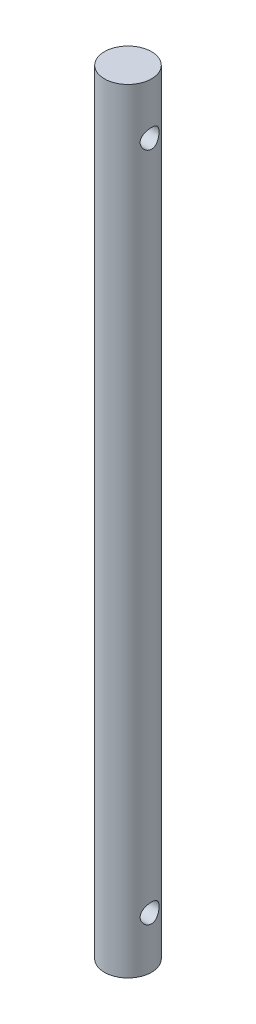
ISO-10303-21;
HEADER;
FILE_DESCRIPTION(('STEP AP214'),'2;1');
FILE_NAME('part.step','',(''),(''),'','','');
FILE_SCHEMA(('AUTOMOTIVE_DESIGN { 1 0 10303 214 1 1 1 1 }'));
ENDSEC;
DATA;
#1=APPLICATION_CONTEXT('core data for automotive mechanical design processes');
#2=APPLICATION_PROTOCOL_DEFINITION('international standard','automotive_design',2000,#1);
#3=PRODUCT_CONTEXT('',#1,'mechanical');
#4=PRODUCT('Part','Part','',(#3));
#5=PRODUCT_RELATED_PRODUCT_CATEGORY('part','',(#4));
#6=PRODUCT_DEFINITION_FORMATION('','',#4);
#7=PRODUCT_DEFINITION_CONTEXT('part definition',#1,'design');
#8=PRODUCT_DEFINITION('design','',#6,#7);
#9=PRODUCT_DEFINITION_SHAPE('','',#8);
#10=(LENGTH_UNIT() NAMED_UNIT(*) SI_UNIT(.MILLI.,.METRE.));
#11=(NAMED_UNIT(*) PLANE_ANGLE_UNIT() SI_UNIT($,.RADIAN.));
#12=(NAMED_UNIT(*) SI_UNIT($,.STERADIAN.) SOLID_ANGLE_UNIT());
#13=UNCERTAINTY_MEASURE_WITH_UNIT(LENGTH_MEASURE(1.E-05),#10,'distance_accuracy_value','');
#14=(GEOMETRIC_REPRESENTATION_CONTEXT(3) GLOBAL_UNCERTAINTY_ASSIGNED_CONTEXT((#13)) GLOBAL_UNIT_ASSIGNED_CONTEXT((#10,
#11,#12)) REPRESENTATION_CONTEXT('',''));
#15=CARTESIAN_POINT('',(0.,0.,0.));
#16=DIRECTION('',(0.,0.,1.));
#17=DIRECTION('',(1.,0.,0.));
#18=AXIS2_PLACEMENT_3D('',#15,#16,#17);
#19=CARTESIAN_POINT('',(0.,65.0875,0.));
#20=DIRECTION('',(0.,-1.,0.));
#21=DIRECTION('',(0.,0.,-1.));
#22=AXIS2_PLACEMENT_3D('',#19,#20,#21);
#23=CYLINDRICAL_SURFACE('',#22,3.9624);
#24=CARTESIAN_POINT('',(0.,65.0875,0.));
#25=DIRECTION('',(0.,1.,0.));
#26=DIRECTION('',(0.,0.,1.));
#27=AXIS2_PLACEMENT_3D('',#24,#25,#26);
#28=CIRCLE('',#27,3.9624);
#29=CARTESIAN_POINT('',(0.,65.0875,3.9624));
#30=VERTEX_POINT('',#29);
#31=EDGE_CURVE('E10',#30,#30,#28,.T.);
#32=ORIENTED_EDGE('',*,*,#31,.F.);
#33=EDGE_LOOP('',(#32));
#34=FACE_BOUND('',#33,.T.);
#35=CARTESIAN_POINT('',(0.,-65.0875,0.));
#36=DIRECTION('',(0.,1.,0.));
#37=DIRECTION('',(0.,0.,1.));
#38=AXIS2_PLACEMENT_3D('',#35,#36,#37);
#39=CIRCLE('',#38,3.9624);
#40=CARTESIAN_POINT('',(0.,-65.0875,3.9624));
#41=VERTEX_POINT('',#40);
#42=EDGE_CURVE('E49',#41,#41,#39,.T.);
#43=ORIENTED_EDGE('',*,*,#42,.T.);
#44=EDGE_LOOP('',(#43));
#45=FACE_BOUND('',#44,.T.);
#46=CARTESIAN_POINT('',(-3.63048998208231,56.4261,1.5875));
#47=CARTESIAN_POINT('',(-3.63049860166506,56.5111293845382,1.5874906563305));
#48=CARTESIAN_POINT('',(-3.63351930596472,56.5962783203316,1.58062803868289));
#49=CARTESIAN_POINT('',(-3.64522429294601,56.7641328251157,1.55343427483822));
#50=CARTESIAN_POINT('',(-3.65392301870693,56.8468315993453,1.53306877953104));
#51=CARTESIAN_POINT('',(-3.6758274235157,57.0070727308101,1.47977266239196));
#52=CARTESIAN_POINT('',(-3.68901606873711,57.0846332720007,1.44688947517429));
#53=CARTESIAN_POINT('',(-3.71839056207649,57.2331188224599,1.36963001807658));
#54=CARTESIAN_POINT('',(-3.73457576267749,57.3040452602982,1.3252562303428));
#55=CARTESIAN_POINT('',(-3.7691595137997,57.4413596627695,1.22355108799481));
#56=CARTESIAN_POINT('',(-3.78762941074348,57.5073194589445,1.16566565871302));
#57=CARTESIAN_POINT('',(-3.82411226056762,57.6289079566135,1.03974672153166));
#58=CARTESIAN_POINT('',(-3.84212505160211,57.6845330418104,0.971709676362397));
#59=CARTESIAN_POINT('',(-3.87652106762559,57.7860007114836,0.824109089564598));
#60=CARTESIAN_POINT('',(-3.89281157889371,57.8313689771764,0.744195920297095));
#61=CARTESIAN_POINT('',(-3.92106236727906,57.907835699004,0.577102307633441));
#62=CARTESIAN_POINT('',(-3.933024411366,57.9389399793815,0.489924847591702));
#63=CARTESIAN_POINT('',(-3.95076527021463,57.9844667474669,0.315267314673546));
#64=CARTESIAN_POINT('',(-3.95681609122412,57.9996258371754,0.228007430733204));
#65=CARTESIAN_POINT('',(-3.9630360750103,58.0152041272629,0.0519866998195689));
#66=CARTESIAN_POINT('',(-3.96320743882591,58.0156288436159,-0.0367735730163148));
#67=CARTESIAN_POINT('',(-3.95781451142904,58.0021294750461,-0.207949906853738));
#68=CARTESIAN_POINT('',(-3.95257286194732,57.9890125506948,-0.290441633410352));
#69=CARTESIAN_POINT('',(-3.93737807246517,57.9501755779891,-0.451939194524755));
#70=CARTESIAN_POINT('',(-3.9274245866756,57.9244546046522,-0.530944772778123));
#71=CARTESIAN_POINT('',(-3.90358943514598,57.8608240980416,-0.684652184104047));
#72=CARTESIAN_POINT('',(-3.88965079236787,57.8227365991651,-0.759271143743957));
#73=CARTESIAN_POINT('',(-3.85922785772182,57.7356212476473,-0.90125127765039));
#74=CARTESIAN_POINT('',(-3.84274269277477,57.6865896402264,-0.968609949217902));
#75=CARTESIAN_POINT('',(-3.80761790365709,57.5752157614139,-1.09886592962498));
#76=CARTESIAN_POINT('',(-3.78890789152213,57.5122096645085,-1.16117751121798));
#77=CARTESIAN_POINT('',(-3.75227824677165,57.3765703921452,-1.27459067863638));
#78=CARTESIAN_POINT('',(-3.73435887609313,57.3039340576677,-1.32568857135318));
#79=CARTESIAN_POINT('',(-3.70085976659175,57.148469067178,-1.41656981233452));
#80=CARTESIAN_POINT('',(-3.68536097780276,57.0654094418711,-1.45599039620024));
#81=CARTESIAN_POINT('',(-3.6594077545824,56.8930444613565,-1.52005182761746));
#82=CARTESIAN_POINT('',(-3.64895003225009,56.8037432207188,-1.54470231112915));
#83=CARTESIAN_POINT('',(-3.63506177785545,56.627273783136,-1.5770965133273));
#84=CARTESIAN_POINT('',(-3.63124011374553,56.5403098789753,-1.58578317134363));
#85=CARTESIAN_POINT('',(-3.62994222523247,56.3661019763384,-1.58875397256678));
#86=CARTESIAN_POINT('',(-3.63246406689444,56.2788580713248,-1.58304250530683));
#87=CARTESIAN_POINT('',(-3.64316752573291,56.111815271001,-1.55823779642885));
#88=CARTESIAN_POINT('',(-3.65101705710506,56.0318760100021,-1.53992890484142));
#89=CARTESIAN_POINT('',(-3.6710790409435,55.8762576654666,-1.49146743619685));
#90=CARTESIAN_POINT('',(-3.68329246269244,55.800579532714,-1.46131222775465));
#91=CARTESIAN_POINT('',(-3.71131306850803,55.6522027243057,-1.38864671191941));
#92=CARTESIAN_POINT('',(-3.72724609634123,55.5797500019243,-1.34568423093518));
#93=CARTESIAN_POINT('',(-3.76071925377471,55.442751921432,-1.24908549925997));
#94=CARTESIAN_POINT('',(-3.77826003792424,55.3782098091029,-1.19544489078506));
#95=CARTESIAN_POINT('',(-3.8145427293604,55.2538905323707,-1.07431732957439));
#96=CARTESIAN_POINT('',(-3.83327726112235,55.1948215114262,-1.00609861662742));
#97=CARTESIAN_POINT('',(-3.86861354480797,55.0888590810262,-0.860270332155498));
#98=CARTESIAN_POINT('',(-3.88521520750415,55.0419661808687,-0.782660368015921));
#99=CARTESIAN_POINT('',(-3.91446977344994,54.9618560771463,-0.619969034383928));
#100=CARTESIAN_POINT('',(-3.92712323745666,54.9286369313032,-0.534888728095191));
#101=CARTESIAN_POINT('',(-3.94702042089246,54.8772032241517,-0.359715491215371));
#102=CARTESIAN_POINT('',(-3.95426708654169,54.8589804905853,-0.26962531935344));
#103=CARTESIAN_POINT('',(-3.9622183136021,54.8390299335087,-0.0933465475917312));
#104=CARTESIAN_POINT('',(-3.96331986080945,54.8363009632467,-0.00728829442001628));
#105=CARTESIAN_POINT('',(-3.95993014534731,54.8447698025987,0.164018576016514));
#106=CARTESIAN_POINT('',(-3.95543973400656,54.8559654922999,0.249267314532401));
#107=CARTESIAN_POINT('',(-3.94156960694888,54.8912502800895,0.413834923342558));
#108=CARTESIAN_POINT('',(-3.9323452183939,54.9149303868366,0.493255625112023));
#109=CARTESIAN_POINT('',(-3.90999589418671,54.9740814509483,0.646981594384498));
#110=CARTESIAN_POINT('',(-3.89687024029795,55.0095545795919,0.721285916839038));
#111=CARTESIAN_POINT('',(-3.86728397994749,55.0930521044932,0.866282923379317));
#112=CARTESIAN_POINT('',(-3.85070153581702,55.1415622922627,0.93667045523537));
#113=CARTESIAN_POINT('',(-3.81619715197457,55.2490314341318,1.06860248328371));
#114=CARTESIAN_POINT('',(-3.79827465712802,55.307994732601,1.13014328339426));
#115=CARTESIAN_POINT('',(-3.76172535168452,55.439024973444,1.2465916081757));
#116=CARTESIAN_POINT('',(-3.74312399092213,55.5116785362286,1.30084921065205));
#117=CARTESIAN_POINT('',(-3.70852195241108,55.6656491653313,1.39645088057639));
#118=CARTESIAN_POINT('',(-3.69252157720419,55.7469672376703,1.43779344628619));
#119=CARTESIAN_POINT('',(-3.66640976376903,55.9085306366957,1.50305593202854));
#120=CARTESIAN_POINT('',(-3.65589801573786,55.9882142463979,1.52820871192439));
#121=CARTESIAN_POINT('',(-3.64001365683373,56.15089574057,1.56567684110844));
#122=CARTESIAN_POINT('',(-3.63462674435827,56.2338837244735,1.5780279240854));
#123=CARTESIAN_POINT('',(-3.63103181794639,56.3535062646917,1.58625841384787));
#124=CARTESIAN_POINT('',(-3.63048630149823,56.3897922333837,1.58750398977098));
#125=CARTESIAN_POINT('',(-3.63048998208231,56.4261,1.5875));
#126=B_SPLINE_CURVE_WITH_KNOTS('',3,(#46,#47,#48,#49,#50,#51,#52,#53,#54,#55,#56,#57,#58,#59,
#60,#61,#62,#63,#64,#65,#66,#67,#68,#69,#70,#71,#72,#73,#74,#75,#76,#77,#78,#79,#80,#81,#82,#83,
#84,#85,#86,#87,#88,#89,#90,#91,#92,#93,#94,#95,#96,#97,#98,#99,#100,#101,#102,#103,#104,#105,
#106,#107,#108,#109,#110,#111,#112,#113,#114,#115,#116,#117,#118,#119,#120,#121,#122,#123,#124,
#125),.UNSPECIFIED.,.T.,.F.,(4,2,2,2,2,2,2,2,2,2,2,2,2,2,2,2,2,2,2,2,2,2,2,2,2,2,2,2,2,2,2,2,2,
2,2,2,2,2,2,4),(0.,0.254975059857857,0.510601235908147,0.765268230907546,1.01988025974786,
1.28774029193082,1.55569387724708,1.83425280969733,2.11269790000774,2.37762413584636,
2.64245119257701,2.89235609221845,3.14227933455946,3.3959716653771,3.64975116884933,
3.9202394699415,4.19081672022148,4.46908250974915,4.74716656145541,5.00822041169193,
5.26919468448779,5.5152370353265,5.7613340697085,6.0174291829533,6.27362902463016,
6.54882529246466,6.82403306924857,7.09920174084937,7.37422036047742,7.63124650264929,
7.88823351953261,8.13728161881956,8.3863755971601,8.64648818701369,8.90670913559175,
9.18310200074596,9.45952699243322,9.71108213833464,9.96193320560449,10.0708082141275),.UNSPECIFIED.);
#127=CARTESIAN_POINT('',(-3.63048998208231,56.4261,1.5875));
#128=VERTEX_POINT('',#127);
#129=EDGE_CURVE('E57',#128,#128,#126,.T.);
#130=ORIENTED_EDGE('',*,*,#129,.F.);
#131=EDGE_LOOP('',(#130));
#132=FACE_BOUND('',#131,.T.);
#133=CARTESIAN_POINT('',(3.63048998208231,56.4261,1.5875));
#134=CARTESIAN_POINT('',(3.63049860166506,56.3410706154618,1.5874906563305));
#135=CARTESIAN_POINT('',(3.63351930596472,56.2559216796684,1.58062803868289));
#136=CARTESIAN_POINT('',(3.64522429294601,56.0880671748843,1.55343427483822));
#137=CARTESIAN_POINT('',(3.65392301870693,56.0053684006547,1.53306877953104));
#138=CARTESIAN_POINT('',(3.6758274235157,55.8451272691899,1.47977266239196));
#139=CARTESIAN_POINT('',(3.68901606873711,55.7675667279993,1.44688947517429));
#140=CARTESIAN_POINT('',(3.71839056207649,55.6190811775401,1.36963001807658));
#141=CARTESIAN_POINT('',(3.73457576267749,55.5481547397018,1.3252562303428));
#142=CARTESIAN_POINT('',(3.7691595137997,55.4108403372304,1.22355108799481));
#143=CARTESIAN_POINT('',(3.78762941074348,55.3448805410555,1.16566565871302));
#144=CARTESIAN_POINT('',(3.82411226056762,55.2232920433865,1.03974672153166));
#145=CARTESIAN_POINT('',(3.84212505160211,55.1676669581896,0.971709676362397));
#146=CARTESIAN_POINT('',(3.87652106762559,55.0661992885164,0.824109089564598));
#147=CARTESIAN_POINT('',(3.89281157889371,55.0208310228235,0.744195920297095));
#148=CARTESIAN_POINT('',(3.92106236727906,54.944364300996,0.577102307633441));
#149=CARTESIAN_POINT('',(3.933024411366,54.9132600206185,0.489924847591702));
#150=CARTESIAN_POINT('',(3.95076527021463,54.8677332525331,0.315267314673546));
#151=CARTESIAN_POINT('',(3.95681609122412,54.8525741628246,0.228007430733205));
#152=CARTESIAN_POINT('',(3.9630360750103,54.8369958727371,0.0519866998195697));
#153=CARTESIAN_POINT('',(3.96320743882591,54.8365711563841,-0.0367735730163145));
#154=CARTESIAN_POINT('',(3.95781451142904,54.8500705249539,-0.207949906853738));
#155=CARTESIAN_POINT('',(3.95257286194732,54.8631874493052,-0.290441633410352));
#156=CARTESIAN_POINT('',(3.93737807246517,54.9020244220109,-0.451939194524755));
#157=CARTESIAN_POINT('',(3.9274245866756,54.9277453953477,-0.530944772778123));
#158=CARTESIAN_POINT('',(3.90358943514598,54.9913759019584,-0.684652184104047));
#159=CARTESIAN_POINT('',(3.88965079236787,55.0294634008349,-0.759271143743957));
#160=CARTESIAN_POINT('',(3.85922785772182,55.1165787523527,-0.90125127765039));
#161=CARTESIAN_POINT('',(3.84274269277477,55.1656103597736,-0.968609949217902));
#162=CARTESIAN_POINT('',(3.80761790365709,55.2769842385861,-1.09886592962498));
#163=CARTESIAN_POINT('',(3.78890789152213,55.3399903354915,-1.16117751121798));
#164=CARTESIAN_POINT('',(3.75227824677165,55.4756296078548,-1.27459067863638));
#165=CARTESIAN_POINT('',(3.73435887609313,55.5482659423322,-1.32568857135318));
#166=CARTESIAN_POINT('',(3.70085976659175,55.7037309328219,-1.41656981233452));
#167=CARTESIAN_POINT('',(3.68536097780276,55.7867905581289,-1.45599039620024));
#168=CARTESIAN_POINT('',(3.6594077545824,55.9591555386435,-1.52005182761746));
#169=CARTESIAN_POINT('',(3.64895003225009,56.0484567792812,-1.54470231112915));
#170=CARTESIAN_POINT('',(3.63506177785545,56.224926216864,-1.5770965133273));
#171=CARTESIAN_POINT('',(3.63124011374553,56.3118901210247,-1.58578317134363));
#172=CARTESIAN_POINT('',(3.62994222523247,56.4860980236615,-1.58875397256678));
#173=CARTESIAN_POINT('',(3.63246406689444,56.5733419286752,-1.58304250530683));
#174=CARTESIAN_POINT('',(3.64316752573291,56.740384728999,-1.55823779642885));
#175=CARTESIAN_POINT('',(3.65101705710506,56.8203239899979,-1.53992890484142));
#176=CARTESIAN_POINT('',(3.6710790409435,56.9759423345334,-1.49146743619685));
#177=CARTESIAN_POINT('',(3.68329246269244,57.051620467286,-1.46131222775466));
#178=CARTESIAN_POINT('',(3.71131306850803,57.1999972756943,-1.38864671191941));
#179=CARTESIAN_POINT('',(3.72724609634123,57.2724499980756,-1.34568423093518));
#180=CARTESIAN_POINT('',(3.76071925377471,57.409448078568,-1.24908549925997));
#181=CARTESIAN_POINT('',(3.77826003792424,57.4739901908971,-1.19544489078506));
#182=CARTESIAN_POINT('',(3.8145427293604,57.5983094676293,-1.07431732957439));
#183=CARTESIAN_POINT('',(3.83327726112235,57.6573784885738,-1.00609861662742));
#184=CARTESIAN_POINT('',(3.86861354480797,57.7633409189738,-0.860270332155498));
#185=CARTESIAN_POINT('',(3.88521520750415,57.8102338191313,-0.782660368015921));
#186=CARTESIAN_POINT('',(3.91446977344994,57.8903439228537,-0.619969034383928));
#187=CARTESIAN_POINT('',(3.92712323745666,57.9235630686967,-0.534888728095191));
#188=CARTESIAN_POINT('',(3.94702042089246,57.9749967758483,-0.359715491215371));
#189=CARTESIAN_POINT('',(3.95426708654169,57.9932195094147,-0.26962531935344));
#190=CARTESIAN_POINT('',(3.9622183136021,58.0131700664912,-0.0933465475917312));
#191=CARTESIAN_POINT('',(3.96331986080945,58.0158990367533,-0.00728829442001628));
#192=CARTESIAN_POINT('',(3.95993014534731,58.0074301974013,0.164018576016514));
#193=CARTESIAN_POINT('',(3.95543973400656,57.9962345077001,0.249267314532401));
#194=CARTESIAN_POINT('',(3.94156960694888,57.9609497199105,0.413834923342558));
#195=CARTESIAN_POINT('',(3.9323452183939,57.9372696131634,0.493255625112023));
#196=CARTESIAN_POINT('',(3.90999589418671,57.8781185490517,0.646981594384498));
#197=CARTESIAN_POINT('',(3.89687024029795,57.8426454204081,0.721285916839038));
#198=CARTESIAN_POINT('',(3.86728397994749,57.7591478955068,0.866282923379317));
#199=CARTESIAN_POINT('',(3.85070153581702,57.7106377077372,0.93667045523537));
#200=CARTESIAN_POINT('',(3.81619715197457,57.6031685658681,1.06860248328371));
#201=CARTESIAN_POINT('',(3.79827465712802,57.544205267399,1.13014328339426));
#202=CARTESIAN_POINT('',(3.76172535168452,57.413175026556,1.2465916081757));
#203=CARTESIAN_POINT('',(3.74312399092213,57.3405214637713,1.30084921065205));
#204=CARTESIAN_POINT('',(3.70852195241108,57.1865508346687,1.39645088057639));
#205=CARTESIAN_POINT('',(3.69252157720419,57.1052327623296,1.43779344628619));
#206=CARTESIAN_POINT('',(3.66640976376903,56.9436693633043,1.50305593202854));
#207=CARTESIAN_POINT('',(3.65589801573787,56.8639857536021,1.52820871192439));
#208=CARTESIAN_POINT('',(3.64001365683373,56.70130425943,1.56567684110844));
#209=CARTESIAN_POINT('',(3.63462674435827,56.6183162755265,1.5780279240854));
#210=CARTESIAN_POINT('',(3.63103181794639,56.4986937353083,1.58625841384787));
#211=CARTESIAN_POINT('',(3.63048630149823,56.4624077666163,1.58750398977098));
#212=CARTESIAN_POINT('',(3.63048998208231,56.4261,1.5875));
#213=B_SPLINE_CURVE_WITH_KNOTS('',3,(#133,#134,#135,#136,#137,#138,#139,#140,#141,#142,#143,
#144,#145,#146,#147,#148,#149,#150,#151,#152,#153,#154,#155,#156,#157,#158,#159,#160,#161,#162,
#163,#164,#165,#166,#167,#168,#169,#170,#171,#172,#173,#174,#175,#176,#177,#178,#179,#180,#181,
#182,#183,#184,#185,#186,#187,#188,#189,#190,#191,#192,#193,#194,#195,#196,#197,#198,#199,#200,
#201,#202,#203,#204,#205,#206,#207,#208,#209,#210,#211,#212),.UNSPECIFIED.,.T.,.F.,(4,2,2,2,2,2,
2,2,2,2,2,2,2,2,2,2,2,2,2,2,2,2,2,2,2,2,2,2,2,2,2,2,2,2,2,2,2,2,2,4),(0.,0.254975059857857,
0.510601235908147,0.765268230907546,1.01988025974786,1.28774029193082,1.55569387724708,
1.83425280969733,2.11269790000774,2.37762413584636,2.64245119257701,2.89235609221845,
3.14227933455946,3.3959716653771,3.64975116884933,3.9202394699415,4.19081672022148,
4.46908250974915,4.74716656145541,5.00822041169193,5.26919468448779,5.51523703532649,
5.7613340697085,6.01742918295329,6.27362902463016,6.54882529246466,6.82403306924857,
7.09920174084937,7.37422036047742,7.63124650264929,7.88823351953261,8.13728161881956,
8.3863755971601,8.64648818701369,8.90670913559175,9.18310200074596,9.45952699243321,
9.71108213833463,9.96193320560449,10.0708082141275),.UNSPECIFIED.);
#214=CARTESIAN_POINT('',(3.63048998208231,56.4261,1.5875));
#215=VERTEX_POINT('',#214);
#216=EDGE_CURVE('E54',#215,#215,#213,.T.);
#217=ORIENTED_EDGE('',*,*,#216,.F.);
#218=EDGE_LOOP('',(#217));
#219=FACE_BOUND('',#218,.T.);
#220=CARTESIAN_POINT('',(-3.63048998208231,-56.4261,1.5875));
#221=CARTESIAN_POINT('',(-3.63049860166506,-56.3410706154618,1.5874906563305));
#222=CARTESIAN_POINT('',(-3.63351930596472,-56.2559216796684,1.58062803868289));
#223=CARTESIAN_POINT('',(-3.64522429294601,-56.0880671748843,1.55343427483822));
#224=CARTESIAN_POINT('',(-3.65392301870693,-56.0053684006547,1.53306877953104));
#225=CARTESIAN_POINT('',(-3.6758274235157,-55.8451272691899,1.47977266239196));
#226=CARTESIAN_POINT('',(-3.68901606873711,-55.7675667279993,1.44688947517429));
#227=CARTESIAN_POINT('',(-3.71839056207649,-55.6190811775401,1.36963001807658));
#228=CARTESIAN_POINT('',(-3.73457576267749,-55.5481547397018,1.3252562303428));
#229=CARTESIAN_POINT('',(-3.7691595137997,-55.4108403372304,1.22355108799481));
#230=CARTESIAN_POINT('',(-3.78762941074348,-55.3448805410555,1.16566565871302));
#231=CARTESIAN_POINT('',(-3.82411226056762,-55.2232920433865,1.03974672153166));
#232=CARTESIAN_POINT('',(-3.84212505160211,-55.1676669581896,0.971709676362397));
#233=CARTESIAN_POINT('',(-3.87652106762559,-55.0661992885164,0.824109089564598));
#234=CARTESIAN_POINT('',(-3.89281157889371,-55.0208310228235,0.744195920297095));
#235=CARTESIAN_POINT('',(-3.92106236727906,-54.944364300996,0.577102307633441));
#236=CARTESIAN_POINT('',(-3.933024411366,-54.9132600206185,0.489924847591702));
#237=CARTESIAN_POINT('',(-3.95076527021463,-54.8677332525331,0.315267314673546));
#238=CARTESIAN_POINT('',(-3.95681609122412,-54.8525741628246,0.228007430733205));
#239=CARTESIAN_POINT('',(-3.9630360750103,-54.8369958727371,0.0519866998195697));
#240=CARTESIAN_POINT('',(-3.96320743882591,-54.8365711563841,-0.0367735730163145));
#241=CARTESIAN_POINT('',(-3.95781451142904,-54.8500705249539,-0.207949906853738));
#242=CARTESIAN_POINT('',(-3.95257286194732,-54.8631874493052,-0.290441633410352));
#243=CARTESIAN_POINT('',(-3.93737807246517,-54.9020244220109,-0.451939194524755));
#244=CARTESIAN_POINT('',(-3.9274245866756,-54.9277453953477,-0.530944772778123));
#245=CARTESIAN_POINT('',(-3.90358943514598,-54.9913759019584,-0.684652184104047));
#246=CARTESIAN_POINT('',(-3.88965079236787,-55.0294634008349,-0.759271143743957));
#247=CARTESIAN_POINT('',(-3.85922785772182,-55.1165787523527,-0.90125127765039));
#248=CARTESIAN_POINT('',(-3.84274269277477,-55.1656103597736,-0.968609949217902));
#249=CARTESIAN_POINT('',(-3.80761790365709,-55.2769842385861,-1.09886592962498));
#250=CARTESIAN_POINT('',(-3.78890789152213,-55.3399903354915,-1.16117751121798));
#251=CARTESIAN_POINT('',(-3.75227824677165,-55.4756296078548,-1.27459067863638));
#252=CARTESIAN_POINT('',(-3.73435887609313,-55.5482659423322,-1.32568857135318));
#253=CARTESIAN_POINT('',(-3.70085976659175,-55.7037309328219,-1.41656981233452));
#254=CARTESIAN_POINT('',(-3.68536097780276,-55.7867905581289,-1.45599039620024));
#255=CARTESIAN_POINT('',(-3.6594077545824,-55.9591555386435,-1.52005182761746));
#256=CARTESIAN_POINT('',(-3.64895003225009,-56.0484567792812,-1.54470231112915));
#257=CARTESIAN_POINT('',(-3.63506177785545,-56.224926216864,-1.5770965133273));
#258=CARTESIAN_POINT('',(-3.63124011374553,-56.3118901210247,-1.58578317134363));
#259=CARTESIAN_POINT('',(-3.62994222523247,-56.4860980236615,-1.58875397256678));
#260=CARTESIAN_POINT('',(-3.63246406689444,-56.5733419286752,-1.58304250530683));
#261=CARTESIAN_POINT('',(-3.64316752573291,-56.740384728999,-1.55823779642885));
#262=CARTESIAN_POINT('',(-3.65101705710506,-56.8203239899979,-1.53992890484142));
#263=CARTESIAN_POINT('',(-3.6710790409435,-56.9759423345334,-1.49146743619685));
#264=CARTESIAN_POINT('',(-3.68329246269244,-57.051620467286,-1.46131222775466));
#265=CARTESIAN_POINT('',(-3.71131306850803,-57.1999972756943,-1.38864671191941));
#266=CARTESIAN_POINT('',(-3.72724609634123,-57.2724499980756,-1.34568423093518));
#267=CARTESIAN_POINT('',(-3.76071925377471,-57.409448078568,-1.24908549925997));
#268=CARTESIAN_POINT('',(-3.77826003792424,-57.4739901908971,-1.19544489078506));
#269=CARTESIAN_POINT('',(-3.8145427293604,-57.5983094676293,-1.07431732957439));
#270=CARTESIAN_POINT('',(-3.83327726112235,-57.6573784885738,-1.00609861662742));
#271=CARTESIAN_POINT('',(-3.86861354480797,-57.7633409189738,-0.860270332155498));
#272=CARTESIAN_POINT('',(-3.88521520750415,-57.8102338191313,-0.782660368015921));
#273=CARTESIAN_POINT('',(-3.91446977344994,-57.8903439228537,-0.619969034383928));
#274=CARTESIAN_POINT('',(-3.92712323745666,-57.9235630686967,-0.534888728095191));
#275=CARTESIAN_POINT('',(-3.94702042089246,-57.9749967758483,-0.359715491215371));
#276=CARTESIAN_POINT('',(-3.95426708654169,-57.9932195094147,-0.26962531935344));
#277=CARTESIAN_POINT('',(-3.9622183136021,-58.0131700664912,-0.0933465475917312));
#278=CARTESIAN_POINT('',(-3.96331986080945,-58.0158990367533,-0.00728829442001628));
#279=CARTESIAN_POINT('',(-3.95993014534731,-58.0074301974013,0.164018576016514));
#280=CARTESIAN_POINT('',(-3.95543973400656,-57.9962345077001,0.249267314532401));
#281=CARTESIAN_POINT('',(-3.94156960694888,-57.9609497199105,0.413834923342558));
#282=CARTESIAN_POINT('',(-3.9323452183939,-57.9372696131634,0.493255625112023));
#283=CARTESIAN_POINT('',(-3.90999589418671,-57.8781185490517,0.646981594384498));
#284=CARTESIAN_POINT('',(-3.89687024029795,-57.8426454204081,0.721285916839038));
#285=CARTESIAN_POINT('',(-3.86728397994749,-57.7591478955068,0.866282923379317));
#286=CARTESIAN_POINT('',(-3.85070153581702,-57.7106377077372,0.93667045523537));
#287=CARTESIAN_POINT('',(-3.81619715197457,-57.6031685658681,1.06860248328371));
#288=CARTESIAN_POINT('',(-3.79827465712802,-57.544205267399,1.13014328339426));
#289=CARTESIAN_POINT('',(-3.76172535168452,-57.413175026556,1.2465916081757));
#290=CARTESIAN_POINT('',(-3.74312399092213,-57.3405214637713,1.30084921065205));
#291=CARTESIAN_POINT('',(-3.70852195241108,-57.1865508346687,1.39645088057639));
#292=CARTESIAN_POINT('',(-3.69252157720419,-57.1052327623296,1.43779344628619));
#293=CARTESIAN_POINT('',(-3.66640976376903,-56.9436693633043,1.50305593202854));
#294=CARTESIAN_POINT('',(-3.65589801573787,-56.8639857536021,1.52820871192439));
#295=CARTESIAN_POINT('',(-3.64001365683373,-56.70130425943,1.56567684110844));
#296=CARTESIAN_POINT('',(-3.63462674435827,-56.6183162755265,1.5780279240854));
#297=CARTESIAN_POINT('',(-3.63103181794639,-56.4986937353083,1.58625841384787));
#298=CARTESIAN_POINT('',(-3.63048630149823,-56.4624077666163,1.58750398977098));
#299=CARTESIAN_POINT('',(-3.63048998208231,-56.4261,1.5875));
#300=B_SPLINE_CURVE_WITH_KNOTS('',3,(#220,#221,#222,#223,#224,#225,#226,#227,#228,#229,#230,
#231,#232,#233,#234,#235,#236,#237,#238,#239,#240,#241,#242,#243,#244,#245,#246,#247,#248,#249,
#250,#251,#252,#253,#254,#255,#256,#257,#258,#259,#260,#261,#262,#263,#264,#265,#266,#267,#268,
#269,#270,#271,#272,#273,#274,#275,#276,#277,#278,#279,#280,#281,#282,#283,#284,#285,#286,#287,
#288,#289,#290,#291,#292,#293,#294,#295,#296,#297,#298,#299),.UNSPECIFIED.,.T.,.F.,(4,2,2,2,2,2,
2,2,2,2,2,2,2,2,2,2,2,2,2,2,2,2,2,2,2,2,2,2,2,2,2,2,2,2,2,2,2,2,2,4),(0.,0.254975059857857,
0.510601235908147,0.765268230907546,1.01988025974786,1.28774029193082,1.55569387724708,
1.83425280969733,2.11269790000774,2.37762413584636,2.64245119257701,2.89235609221845,
3.14227933455946,3.3959716653771,3.64975116884933,3.9202394699415,4.19081672022148,
4.46908250974915,4.74716656145541,5.00822041169193,5.26919468448779,5.51523703532649,
5.7613340697085,6.01742918295329,6.27362902463016,6.54882529246466,6.82403306924857,
7.09920174084937,7.37422036047742,7.63124650264929,7.88823351953261,8.13728161881956,
8.3863755971601,8.64648818701369,8.90670913559175,9.18310200074596,9.45952699243321,
9.71108213833463,9.96193320560449,10.0708082141275),.UNSPECIFIED.);
#301=CARTESIAN_POINT('',(-3.63048998208231,-56.4261,1.5875));
#302=VERTEX_POINT('',#301);
#303=EDGE_CURVE('E98',#302,#302,#300,.T.);
#304=ORIENTED_EDGE('',*,*,#303,.F.);
#305=EDGE_LOOP('',(#304));
#306=FACE_BOUND('',#305,.T.);
#307=CARTESIAN_POINT('',(3.63048998208231,-56.4261,1.5875));
#308=CARTESIAN_POINT('',(3.63049860166506,-56.5111293845382,1.5874906563305));
#309=CARTESIAN_POINT('',(3.63351930596472,-56.5962783203316,1.58062803868289));
#310=CARTESIAN_POINT('',(3.64522429294601,-56.7641328251157,1.55343427483822));
#311=CARTESIAN_POINT('',(3.65392301870693,-56.8468315993453,1.53306877953104));
#312=CARTESIAN_POINT('',(3.6758274235157,-57.0070727308101,1.47977266239196));
#313=CARTESIAN_POINT('',(3.68901606873711,-57.0846332720007,1.44688947517429));
#314=CARTESIAN_POINT('',(3.71839056207649,-57.2331188224599,1.36963001807658));
#315=CARTESIAN_POINT('',(3.73457576267749,-57.3040452602982,1.3252562303428));
#316=CARTESIAN_POINT('',(3.7691595137997,-57.4413596627695,1.22355108799481));
#317=CARTESIAN_POINT('',(3.78762941074348,-57.5073194589445,1.16566565871302));
#318=CARTESIAN_POINT('',(3.82411226056762,-57.6289079566135,1.03974672153166));
#319=CARTESIAN_POINT('',(3.84212505160211,-57.6845330418104,0.971709676362397));
#320=CARTESIAN_POINT('',(3.87652106762559,-57.7860007114836,0.824109089564598));
#321=CARTESIAN_POINT('',(3.89281157889371,-57.8313689771764,0.744195920297095));
#322=CARTESIAN_POINT('',(3.92106236727906,-57.907835699004,0.577102307633441));
#323=CARTESIAN_POINT('',(3.933024411366,-57.9389399793815,0.489924847591702));
#324=CARTESIAN_POINT('',(3.95076527021463,-57.9844667474669,0.315267314673546));
#325=CARTESIAN_POINT('',(3.95681609122412,-57.9996258371754,0.228007430733204));
#326=CARTESIAN_POINT('',(3.9630360750103,-58.0152041272629,0.0519866998195689));
#327=CARTESIAN_POINT('',(3.96320743882591,-58.0156288436159,-0.0367735730163148));
#328=CARTESIAN_POINT('',(3.95781451142904,-58.0021294750461,-0.207949906853738));
#329=CARTESIAN_POINT('',(3.95257286194732,-57.9890125506948,-0.290441633410352));
#330=CARTESIAN_POINT('',(3.93737807246517,-57.9501755779891,-0.451939194524755));
#331=CARTESIAN_POINT('',(3.9274245866756,-57.9244546046522,-0.530944772778123));
#332=CARTESIAN_POINT('',(3.90358943514598,-57.8608240980416,-0.684652184104047));
#333=CARTESIAN_POINT('',(3.88965079236787,-57.8227365991651,-0.759271143743957));
#334=CARTESIAN_POINT('',(3.85922785772182,-57.7356212476473,-0.90125127765039));
#335=CARTESIAN_POINT('',(3.84274269277477,-57.6865896402264,-0.968609949217902));
#336=CARTESIAN_POINT('',(3.80761790365709,-57.5752157614139,-1.09886592962498));
#337=CARTESIAN_POINT('',(3.78890789152213,-57.5122096645085,-1.16117751121798));
#338=CARTESIAN_POINT('',(3.75227824677165,-57.3765703921452,-1.27459067863638));
#339=CARTESIAN_POINT('',(3.73435887609313,-57.3039340576677,-1.32568857135318));
#340=CARTESIAN_POINT('',(3.70085976659175,-57.148469067178,-1.41656981233452));
#341=CARTESIAN_POINT('',(3.68536097780276,-57.0654094418711,-1.45599039620024));
#342=CARTESIAN_POINT('',(3.6594077545824,-56.8930444613565,-1.52005182761746));
#343=CARTESIAN_POINT('',(3.64895003225009,-56.8037432207188,-1.54470231112915));
#344=CARTESIAN_POINT('',(3.63506177785545,-56.627273783136,-1.5770965133273));
#345=CARTESIAN_POINT('',(3.63124011374553,-56.5403098789753,-1.58578317134363));
#346=CARTESIAN_POINT('',(3.62994222523247,-56.3661019763384,-1.58875397256678));
#347=CARTESIAN_POINT('',(3.63246406689444,-56.2788580713248,-1.58304250530683));
#348=CARTESIAN_POINT('',(3.64316752573291,-56.111815271001,-1.55823779642885));
#349=CARTESIAN_POINT('',(3.65101705710506,-56.0318760100021,-1.53992890484142));
#350=CARTESIAN_POINT('',(3.6710790409435,-55.8762576654666,-1.49146743619685));
#351=CARTESIAN_POINT('',(3.68329246269244,-55.800579532714,-1.46131222775465));
#352=CARTESIAN_POINT('',(3.71131306850803,-55.6522027243057,-1.38864671191941));
#353=CARTESIAN_POINT('',(3.72724609634123,-55.5797500019243,-1.34568423093518));
#354=CARTESIAN_POINT('',(3.76071925377471,-55.442751921432,-1.24908549925997));
#355=CARTESIAN_POINT('',(3.77826003792424,-55.3782098091029,-1.19544489078506));
#356=CARTESIAN_POINT('',(3.8145427293604,-55.2538905323707,-1.07431732957439));
#357=CARTESIAN_POINT('',(3.83327726112235,-55.1948215114262,-1.00609861662742));
#358=CARTESIAN_POINT('',(3.86861354480797,-55.0888590810262,-0.860270332155498));
#359=CARTESIAN_POINT('',(3.88521520750415,-55.0419661808687,-0.782660368015921));
#360=CARTESIAN_POINT('',(3.91446977344994,-54.9618560771463,-0.619969034383928));
#361=CARTESIAN_POINT('',(3.92712323745666,-54.9286369313032,-0.534888728095191));
#362=CARTESIAN_POINT('',(3.94702042089246,-54.8772032241517,-0.359715491215371));
#363=CARTESIAN_POINT('',(3.95426708654169,-54.8589804905853,-0.26962531935344));
#364=CARTESIAN_POINT('',(3.9622183136021,-54.8390299335087,-0.0933465475917312));
#365=CARTESIAN_POINT('',(3.96331986080945,-54.8363009632467,-0.00728829442001628));
#366=CARTESIAN_POINT('',(3.95993014534731,-54.8447698025987,0.164018576016514));
#367=CARTESIAN_POINT('',(3.95543973400656,-54.8559654922999,0.249267314532401));
#368=CARTESIAN_POINT('',(3.94156960694888,-54.8912502800895,0.413834923342558));
#369=CARTESIAN_POINT('',(3.9323452183939,-54.9149303868366,0.493255625112023));
#370=CARTESIAN_POINT('',(3.90999589418671,-54.9740814509483,0.646981594384498));
#371=CARTESIAN_POINT('',(3.89687024029795,-55.0095545795919,0.721285916839038));
#372=CARTESIAN_POINT('',(3.86728397994749,-55.0930521044932,0.866282923379317));
#373=CARTESIAN_POINT('',(3.85070153581702,-55.1415622922627,0.93667045523537));
#374=CARTESIAN_POINT('',(3.81619715197457,-55.2490314341318,1.06860248328371));
#375=CARTESIAN_POINT('',(3.79827465712802,-55.307994732601,1.13014328339426));
#376=CARTESIAN_POINT('',(3.76172535168452,-55.439024973444,1.2465916081757));
#377=CARTESIAN_POINT('',(3.74312399092213,-55.5116785362286,1.30084921065205));
#378=CARTESIAN_POINT('',(3.70852195241108,-55.6656491653313,1.39645088057639));
#379=CARTESIAN_POINT('',(3.69252157720419,-55.7469672376703,1.43779344628619));
#380=CARTESIAN_POINT('',(3.66640976376903,-55.9085306366957,1.50305593202854));
#381=CARTESIAN_POINT('',(3.65589801573786,-55.9882142463979,1.52820871192439));
#382=CARTESIAN_POINT('',(3.64001365683373,-56.15089574057,1.56567684110844));
#383=CARTESIAN_POINT('',(3.63462674435827,-56.2338837244735,1.5780279240854));
#384=CARTESIAN_POINT('',(3.63103181794639,-56.3535062646917,1.58625841384787));
#385=CARTESIAN_POINT('',(3.63048630149823,-56.3897922333837,1.58750398977098));
#386=CARTESIAN_POINT('',(3.63048998208231,-56.4261,1.5875));
#387=B_SPLINE_CURVE_WITH_KNOTS('',3,(#307,#308,#309,#310,#311,#312,#313,#314,#315,#316,#317,
#318,#319,#320,#321,#322,#323,#324,#325,#326,#327,#328,#329,#330,#331,#332,#333,#334,#335,#336,
#337,#338,#339,#340,#341,#342,#343,#344,#345,#346,#347,#348,#349,#350,#351,#352,#353,#354,#355,
#356,#357,#358,#359,#360,#361,#362,#363,#364,#365,#366,#367,#368,#369,#370,#371,#372,#373,#374,
#375,#376,#377,#378,#379,#380,#381,#382,#383,#384,#385,#386),.UNSPECIFIED.,.T.,.F.,(4,2,2,2,2,2,
2,2,2,2,2,2,2,2,2,2,2,2,2,2,2,2,2,2,2,2,2,2,2,2,2,2,2,2,2,2,2,2,2,4),(0.,0.254975059857857,
0.510601235908147,0.765268230907546,1.01988025974786,1.28774029193082,1.55569387724708,
1.83425280969733,2.11269790000774,2.37762413584636,2.64245119257701,2.89235609221845,
3.14227933455946,3.3959716653771,3.64975116884933,3.9202394699415,4.19081672022148,
4.46908250974915,4.74716656145541,5.00822041169193,5.26919468448779,5.5152370353265,
5.7613340697085,6.0174291829533,6.27362902463016,6.54882529246466,6.82403306924857,
7.09920174084937,7.37422036047742,7.63124650264929,7.88823351953261,8.13728161881956,
8.3863755971601,8.64648818701369,8.90670913559175,9.18310200074596,9.45952699243322,
9.71108213833464,9.96193320560449,10.0708082141275),.UNSPECIFIED.);
#388=CARTESIAN_POINT('',(3.63048998208231,-56.4261,1.5875));
#389=VERTEX_POINT('',#388);
#390=EDGE_CURVE('E41',#389,#389,#387,.T.);
#391=ORIENTED_EDGE('',*,*,#390,.F.);
#392=EDGE_LOOP('',(#391));
#393=FACE_BOUND('',#392,.T.);
#394=ADVANCED_FACE('F37',(#34,#45,#132,#219,#306,#393),#23,.T.);
#395=CARTESIAN_POINT('',(0.,65.0875,0.));
#396=DIRECTION('',(0.,1.,0.));
#397=DIRECTION('',(0.,0.,1.));
#398=AXIS2_PLACEMENT_3D('',#395,#396,#397);
#399=PLANE('',#398);
#400=ORIENTED_EDGE('',*,*,#31,.T.);
#401=EDGE_LOOP('',(#400));
#402=FACE_BOUND('',#401,.T.);
#403=ADVANCED_FACE('F75',(#402),#399,.T.);
#404=CARTESIAN_POINT('',(0.,-65.0875,0.));
#405=DIRECTION('',(0.,1.,0.));
#406=DIRECTION('',(0.,0.,1.));
#407=AXIS2_PLACEMENT_3D('',#404,#405,#406);
#408=PLANE('',#407);
#409=ORIENTED_EDGE('',*,*,#42,.F.);
#410=EDGE_LOOP('',(#409));
#411=FACE_BOUND('',#410,.T.);
#412=ADVANCED_FACE('F72',(#411),#408,.F.);
#413=CARTESIAN_POINT('',(-15.4456578207962,56.4261,0.));
#414=DIRECTION('',(-1.,0.,0.));
#415=DIRECTION('',(0.,0.,1.));
#416=AXIS2_PLACEMENT_3D('',#413,#414,#415);
#417=CYLINDRICAL_SURFACE('',#416,1.5875);
#418=ORIENTED_EDGE('',*,*,#129,.T.);
#419=EDGE_LOOP('',(#418));
#420=FACE_BOUND('',#419,.T.);
#421=ORIENTED_EDGE('',*,*,#216,.T.);
#422=EDGE_LOOP('',(#421));
#423=FACE_BOUND('',#422,.T.);
#424=ADVANCED_FACE('F67',(#420,#423),#417,.F.);
#425=CARTESIAN_POINT('',(-15.4456578207962,-56.4261,0.));
#426=DIRECTION('',(-1.,0.,0.));
#427=DIRECTION('',(0.,0.,1.));
#428=AXIS2_PLACEMENT_3D('',#425,#426,#427);
#429=CYLINDRICAL_SURFACE('',#428,1.5875);
#430=ORIENTED_EDGE('',*,*,#303,.T.);
#431=EDGE_LOOP('',(#430));
#432=FACE_BOUND('',#431,.T.);
#433=ORIENTED_EDGE('',*,*,#390,.T.);
#434=EDGE_LOOP('',(#433));
#435=FACE_BOUND('',#434,.T.);
#436=ADVANCED_FACE('F71',(#432,#435),#429,.F.);
#437=CLOSED_SHELL('',(#394,#403,#412,#424,#436));
#438=MANIFOLD_SOLID_BREP('B2',#437);
#439=ADVANCED_BREP_SHAPE_REPRESENTATION('',(#18,#438),#14);
#440=SHAPE_DEFINITION_REPRESENTATION(#9,#439);
ENDSEC;
END-ISO-10303-21;
